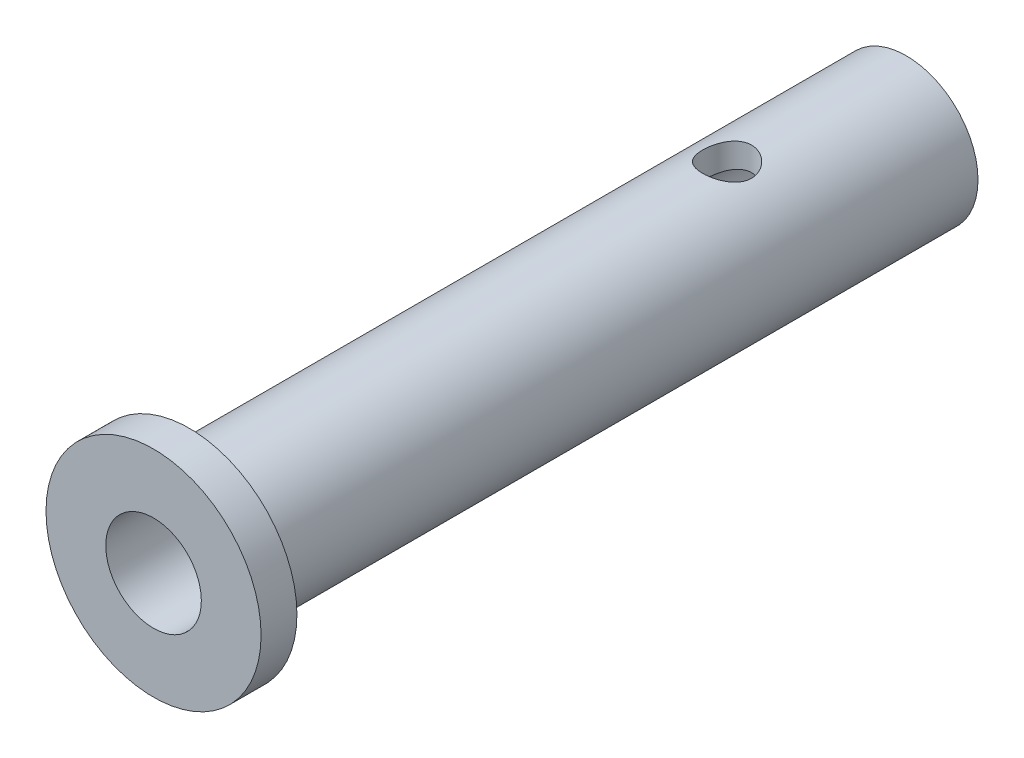
ISO-10303-21;
HEADER;
FILE_DESCRIPTION(('STEP AP214'),'2;1');
FILE_NAME('part.step','',(''),(''),'','','');
FILE_SCHEMA(('AUTOMOTIVE_DESIGN { 1 0 10303 214 1 1 1 1 }'));
ENDSEC;
DATA;
#1=APPLICATION_CONTEXT('core data for automotive mechanical design processes');
#2=APPLICATION_PROTOCOL_DEFINITION('international standard','automotive_design',2000,#1);
#3=PRODUCT_CONTEXT('',#1,'mechanical');
#4=PRODUCT('Part','Part','',(#3));
#5=PRODUCT_RELATED_PRODUCT_CATEGORY('part','',(#4));
#6=PRODUCT_DEFINITION_FORMATION('','',#4);
#7=PRODUCT_DEFINITION_CONTEXT('part definition',#1,'design');
#8=PRODUCT_DEFINITION('design','',#6,#7);
#9=PRODUCT_DEFINITION_SHAPE('','',#8);
#10=(LENGTH_UNIT() NAMED_UNIT(*) SI_UNIT(.MILLI.,.METRE.));
#11=(NAMED_UNIT(*) PLANE_ANGLE_UNIT() SI_UNIT($,.RADIAN.));
#12=(NAMED_UNIT(*) SI_UNIT($,.STERADIAN.) SOLID_ANGLE_UNIT());
#13=UNCERTAINTY_MEASURE_WITH_UNIT(LENGTH_MEASURE(1.E-05),#10,'distance_accuracy_value','');
#14=(GEOMETRIC_REPRESENTATION_CONTEXT(3) GLOBAL_UNCERTAINTY_ASSIGNED_CONTEXT((#13)) GLOBAL_UNIT_ASSIGNED_CONTEXT((#10,
#11,#12)) REPRESENTATION_CONTEXT('',''));
#15=CARTESIAN_POINT('',(0.,0.,0.));
#16=DIRECTION('',(0.,0.,1.));
#17=DIRECTION('',(1.,0.,0.));
#18=AXIS2_PLACEMENT_3D('',#15,#16,#17);
#19=CARTESIAN_POINT('',(0.,0.,0.));
#20=DIRECTION('',(0.,0.,1.));
#21=DIRECTION('',(1.,0.,0.));
#22=AXIS2_PLACEMENT_3D('',#19,#20,#21);
#23=PLANE('',#22);
#24=CARTESIAN_POINT('',(0.,0.,0.));
#25=DIRECTION('',(0.,0.,1.));
#26=DIRECTION('',(1.,0.,0.));
#27=AXIS2_PLACEMENT_3D('',#24,#25,#26);
#28=CIRCLE('',#27,6.);
#29=CARTESIAN_POINT('',(6.,0.,0.));
#30=VERTEX_POINT('',#29);
#31=EDGE_CURVE('E51',#30,#30,#28,.T.);
#32=ORIENTED_EDGE('',*,*,#31,.F.);
#33=EDGE_LOOP('',(#32));
#34=FACE_BOUND('',#33,.T.);
#35=CARTESIAN_POINT('',(0.,0.,0.));
#36=DIRECTION('',(0.,0.,1.));
#37=DIRECTION('',(1.,0.,0.));
#38=AXIS2_PLACEMENT_3D('',#35,#36,#37);
#39=CIRCLE('',#38,4.);
#40=CARTESIAN_POINT('',(4.,0.,0.));
#41=VERTEX_POINT('',#40);
#42=EDGE_CURVE('E59',#41,#41,#39,.T.);
#43=ORIENTED_EDGE('',*,*,#42,.T.);
#44=EDGE_LOOP('',(#43));
#45=FACE_BOUND('',#44,.T.);
#46=ADVANCED_FACE('F36',(#34,#45),#23,.F.);
#47=CARTESIAN_POINT('',(0.,0.,60.));
#48=DIRECTION('',(0.,0.,-1.));
#49=DIRECTION('',(-1.,0.,0.));
#50=AXIS2_PLACEMENT_3D('',#47,#48,#49);
#51=CYLINDRICAL_SURFACE('',#50,6.);
#52=CARTESIAN_POINT('',(0.,-6.,17.05));
#53=CARTESIAN_POINT('',(0.111694792858909,-6.00000073992676,17.0500011006744));
#54=CARTESIAN_POINT('',(0.223381897915284,-5.99685260756627,17.0408419154203));
#55=CARTESIAN_POINT('',(0.443456855274635,-5.9846049865183,17.0045661081946));
#56=CARTESIAN_POINT('',(0.551844528401511,-5.97550517522533,16.9774485128023));
#57=CARTESIAN_POINT('',(0.762116166706496,-5.95234070246869,16.9063006178907));
#58=CARTESIAN_POINT('',(0.864010981474843,-5.9382845943215,16.8622994436983));
#59=CARTESIAN_POINT('',(1.05897336059167,-5.90663546564497,16.7587682473504));
#60=CARTESIAN_POINT('',(1.1520390432572,-5.88904169364257,16.6992349250442));
#61=CARTESIAN_POINT('',(1.33006727595193,-5.851450511483,16.5640703137166));
#62=CARTESIAN_POINT('',(1.41466671273501,-5.83139343672144,16.4879774621349));
#63=CARTESIAN_POINT('',(1.57018420188893,-5.79145754845614,16.3228347015354));
#64=CARTESIAN_POINT('',(1.64109903355776,-5.77157877796381,16.2337817509595));
#65=CARTESIAN_POINT('',(1.7693513085043,-5.73358672426738,16.0419247580762));
#66=CARTESIAN_POINT('',(1.82620897459953,-5.71554573047046,15.9387842891935));
#67=CARTESIAN_POINT('',(1.92161460063447,-5.6841831459689,15.7236893064407));
#68=CARTESIAN_POINT('',(1.9601684725075,-5.67086003179248,15.6117376521291));
#69=CARTESIAN_POINT('',(2.01649607342442,-5.65107176337277,15.3863387462898));
#70=CARTESIAN_POINT('',(2.03495283636109,-5.64438193221697,15.2730825113464));
#71=CARTESIAN_POINT('',(2.05269785632006,-5.63795434219754,15.0448983381978));
#72=CARTESIAN_POINT('',(2.05199239642676,-5.63821430457176,14.9299709602953));
#73=CARTESIAN_POINT('',(2.03196175002273,-5.64546063678503,14.7076091420928));
#74=CARTESIAN_POINT('',(2.01353809218074,-5.65212131593619,14.6000810121759));
#75=CARTESIAN_POINT('',(1.96006848845672,-5.67088406118173,14.389745367431));
#76=CARTESIAN_POINT('',(1.92502045759868,-5.68298680979326,14.2869384464964));
#77=CARTESIAN_POINT('',(1.83872564808495,-5.71149498698225,14.0869561968235));
#78=CARTESIAN_POINT('',(1.78721826814154,-5.72796885781752,13.9899035010933));
#79=CARTESIAN_POINT('',(1.66964783804891,-5.76333553810623,13.8055383281222));
#80=CARTESIAN_POINT('',(1.60358041539568,-5.78222907348994,13.7182287887237));
#81=CARTESIAN_POINT('',(1.45447480555629,-5.82157693917334,13.5507761667373));
#82=CARTESIAN_POINT('',(1.37070277992518,-5.84205994420932,13.4712918699238));
#83=CARTESIAN_POINT('',(1.19076856023099,-5.88137234209153,13.3273233400685));
#84=CARTESIAN_POINT('',(1.09460505604537,-5.90020155973212,13.2628406951422));
#85=CARTESIAN_POINT('',(0.891166665544268,-5.93435426577647,13.1501393560035));
#86=CARTESIAN_POINT('',(0.783782236812027,-5.94963736824087,13.1021053130332));
#87=CARTESIAN_POINT('',(0.561808892830568,-5.97468167028618,13.0249907996112));
#88=CARTESIAN_POINT('',(0.447222629401273,-5.98444488928502,12.9959033970459));
#89=CARTESIAN_POINT('',(0.219669207495524,-5.99701089647794,12.9586938365146));
#90=CARTESIAN_POINT('',(0.106863622694669,-6.00010880305503,12.9496821079156));
#91=CARTESIAN_POINT('',(-0.118675471856099,-5.99988538372896,12.9503349065058));
#92=CARTESIAN_POINT('',(-0.231408990878711,-5.99656520387125,12.9599960993652));
#93=CARTESIAN_POINT('',(-0.449989439131971,-5.98407363027,12.9970213769639));
#94=CARTESIAN_POINT('',(-0.555941535580471,-5.97508513790696,13.0238324546881));
#95=CARTESIAN_POINT('',(-0.761795388188918,-5.95234414939168,13.0936980475587));
#96=CARTESIAN_POINT('',(-0.86169636432468,-5.93859104058192,13.1367546516972));
#97=CARTESIAN_POINT('',(-1.05562283317927,-5.90724765382365,13.2391736396933));
#98=CARTESIAN_POINT('',(-1.14941674652761,-5.88956376716279,13.2989450321282));
#99=CARTESIAN_POINT('',(-1.32592857805976,-5.85235539169635,13.4326202463375));
#100=CARTESIAN_POINT('',(-1.40864295035851,-5.83283031702931,13.5065285741956));
#101=CARTESIAN_POINT('',(-1.56477171280336,-5.79295224237928,13.6705592926373));
#102=CARTESIAN_POINT('',(-1.63755156897234,-5.77260433999457,13.7612883810103));
#103=CARTESIAN_POINT('',(-1.766940556433,-5.73432545769357,13.9541036946464));
#104=CARTESIAN_POINT('',(-1.82354935104245,-5.71639452810288,14.056190156309));
#105=CARTESIAN_POINT('',(-1.91877502508245,-5.68514081736998,14.2689939454274));
#106=CARTESIAN_POINT('',(-1.95741113392835,-5.67181311507377,14.3797018997449));
#107=CARTESIAN_POINT('',(-2.01530235547037,-5.65150563487898,14.6066179017525));
#108=CARTESIAN_POINT('',(-2.03456679128722,-5.64452280350263,14.7228232754436));
#109=CARTESIAN_POINT('',(-2.05241853456071,-5.63805454875059,14.9506948394589));
#110=CARTESIAN_POINT('',(-2.05206438381388,-5.63818529739301,15.0622680856813));
#111=CARTESIAN_POINT('',(-2.03331479460039,-5.64497370037337,15.2836755063015));
#112=CARTESIAN_POINT('',(-2.0149205365416,-5.65163092766803,15.3935097940056));
#113=CARTESIAN_POINT('',(-1.96137782997694,-5.67042949785274,15.6060182786398));
#114=CARTESIAN_POINT('',(-1.92658899078495,-5.68245285046972,15.7087943510224));
#115=CARTESIAN_POINT('',(-1.84154026395086,-5.71058019267023,15.9071270340103));
#116=CARTESIAN_POINT('',(-1.79127683627602,-5.72668511582202,16.0026819864456));
#117=CARTESIAN_POINT('',(-1.67404372112087,-5.76207286091338,16.1885681737578));
#118=CARTESIAN_POINT('',(-1.60641877440901,-5.78146682057555,16.2784648443193));
#119=CARTESIAN_POINT('',(-1.45747162077129,-5.82079914956623,16.44597558441));
#120=CARTESIAN_POINT('',(-1.37614544971747,-5.84073767504921,16.5235860865834));
#121=CARTESIAN_POINT('',(-1.19803272267661,-5.87991159923658,16.6675936572187));
#122=CARTESIAN_POINT('',(-1.10074263507563,-5.89908293822824,16.7333876579543));
#123=CARTESIAN_POINT('',(-0.895842339143445,-5.93365336620008,16.8476245514312));
#124=CARTESIAN_POINT('',(-0.788234154820898,-5.94905319290613,16.8960708383264));
#125=CARTESIAN_POINT('',(-0.568820190045991,-5.97396713574626,16.9728326946112));
#126=CARTESIAN_POINT('',(-0.457216156232393,-5.98363390416873,17.00167368512));
#127=CARTESIAN_POINT('',(-0.230404598197708,-5.99664896852797,17.0402537887369));
#128=CARTESIAN_POINT('',(-0.115198210280347,-5.99999923686471,17.0499988648019));
#129=CARTESIAN_POINT('',(0.,-6.,17.05));
#130=B_SPLINE_CURVE_WITH_KNOTS('',3,(#52,#53,#54,#55,#56,#57,#58,#59,#60,#61,#62,#63,#64,#65,
#66,#67,#68,#69,#70,#71,#72,#73,#74,#75,#76,#77,#78,#79,#80,#81,#82,#83,#84,#85,#86,#87,#88,#89,
#90,#91,#92,#93,#94,#95,#96,#97,#98,#99,#100,#101,#102,#103,#104,#105,#106,#107,#108,#109,#110,
#111,#112,#113,#114,#115,#116,#117,#118,#119,#120,#121,#122,#123,#124,#125,#126,#127,#128,#129),
.UNSPECIFIED.,.T.,.F.,(4,2,2,2,2,2,2,2,2,2,2,2,2,2,2,2,2,2,2,2,2,2,2,2,2,2,2,2,2,2,2,2,2,2,2,2,
2,2,4),(0.,0.334660257833486,0.669338657133644,1.00344229025213,1.33761696901913,
1.68268679490868,2.02783773495886,2.38350996217515,2.7390672327107,3.08212182358097,
3.42506393194116,3.75143184133149,4.07784069357443,4.40969746223985,4.74165402643435,
5.09187847892692,5.44213999027434,5.79621366255634,6.15015771504176,6.48807708016643,
6.8259361103018,7.15341506344945,7.4809361410696,7.81730358610379,8.15377842593176,
8.50635642349643,8.85894176121629,9.21114898665728,9.56318662197828,9.89624920524492,
10.2292899968749,10.5553434031583,10.8814714543009,11.2224163565453,11.5634600731436,
11.9187351731273,12.2739407239956,12.6192057619846,12.9643629691166),.UNSPECIFIED.);
#131=CARTESIAN_POINT('',(0.,-6.,17.05));
#132=VERTEX_POINT('',#131);
#133=EDGE_CURVE('E90',#132,#132,#130,.T.);
#134=ORIENTED_EDGE('',*,*,#133,.T.);
#135=EDGE_LOOP('',(#134));
#136=FACE_BOUND('',#135,.T.);
#137=CARTESIAN_POINT('',(0.,6.,17.05));
#138=CARTESIAN_POINT('',(-0.111694792858909,6.00000073992676,17.0500011006744));
#139=CARTESIAN_POINT('',(-0.223381897915284,5.99685260756627,17.0408419154203));
#140=CARTESIAN_POINT('',(-0.443456855274635,5.9846049865183,17.0045661081946));
#141=CARTESIAN_POINT('',(-0.551844528401511,5.97550517522533,16.9774485128023));
#142=CARTESIAN_POINT('',(-0.762116166706496,5.95234070246869,16.9063006178907));
#143=CARTESIAN_POINT('',(-0.864010981474843,5.9382845943215,16.8622994436983));
#144=CARTESIAN_POINT('',(-1.05897336059167,5.90663546564497,16.7587682473504));
#145=CARTESIAN_POINT('',(-1.1520390432572,5.88904169364257,16.6992349250442));
#146=CARTESIAN_POINT('',(-1.33006727595193,5.851450511483,16.5640703137166));
#147=CARTESIAN_POINT('',(-1.41466671273501,5.83139343672144,16.4879774621349));
#148=CARTESIAN_POINT('',(-1.57018420188893,5.79145754845614,16.3228347015354));
#149=CARTESIAN_POINT('',(-1.64109903355776,5.77157877796381,16.2337817509595));
#150=CARTESIAN_POINT('',(-1.7693513085043,5.73358672426738,16.0419247580762));
#151=CARTESIAN_POINT('',(-1.82620897459953,5.71554573047046,15.9387842891935));
#152=CARTESIAN_POINT('',(-1.92161460063447,5.6841831459689,15.7236893064407));
#153=CARTESIAN_POINT('',(-1.9601684725075,5.67086003179248,15.6117376521291));
#154=CARTESIAN_POINT('',(-2.01649607342442,5.65107176337277,15.3863387462898));
#155=CARTESIAN_POINT('',(-2.03495283636109,5.64438193221697,15.2730825113464));
#156=CARTESIAN_POINT('',(-2.05269785632006,5.63795434219754,15.0448983381978));
#157=CARTESIAN_POINT('',(-2.05199239642676,5.63821430457176,14.9299709602953));
#158=CARTESIAN_POINT('',(-2.03196175002273,5.64546063678503,14.7076091420928));
#159=CARTESIAN_POINT('',(-2.01353809218074,5.65212131593619,14.6000810121759));
#160=CARTESIAN_POINT('',(-1.96006848845672,5.67088406118173,14.389745367431));
#161=CARTESIAN_POINT('',(-1.92502045759868,5.68298680979326,14.2869384464964));
#162=CARTESIAN_POINT('',(-1.83872564808495,5.71149498698225,14.0869561968235));
#163=CARTESIAN_POINT('',(-1.78721826814154,5.72796885781752,13.9899035010933));
#164=CARTESIAN_POINT('',(-1.66964783804891,5.76333553810623,13.8055383281222));
#165=CARTESIAN_POINT('',(-1.60358041539568,5.78222907348994,13.7182287887237));
#166=CARTESIAN_POINT('',(-1.45447480555629,5.82157693917334,13.5507761667373));
#167=CARTESIAN_POINT('',(-1.37070277992518,5.84205994420932,13.4712918699238));
#168=CARTESIAN_POINT('',(-1.19076856023099,5.88137234209153,13.3273233400685));
#169=CARTESIAN_POINT('',(-1.09460505604537,5.90020155973212,13.2628406951422));
#170=CARTESIAN_POINT('',(-0.891166665544268,5.93435426577647,13.1501393560035));
#171=CARTESIAN_POINT('',(-0.783782236812027,5.94963736824087,13.1021053130332));
#172=CARTESIAN_POINT('',(-0.561808892830568,5.97468167028618,13.0249907996112));
#173=CARTESIAN_POINT('',(-0.447222629401273,5.98444488928502,12.9959033970459));
#174=CARTESIAN_POINT('',(-0.219669207495524,5.99701089647794,12.9586938365146));
#175=CARTESIAN_POINT('',(-0.106863622694669,6.00010880305503,12.9496821079156));
#176=CARTESIAN_POINT('',(0.118675471856099,5.99988538372896,12.9503349065058));
#177=CARTESIAN_POINT('',(0.231408990878711,5.99656520387125,12.9599960993652));
#178=CARTESIAN_POINT('',(0.449989439131971,5.98407363027,12.9970213769639));
#179=CARTESIAN_POINT('',(0.555941535580471,5.97508513790696,13.0238324546881));
#180=CARTESIAN_POINT('',(0.761795388188918,5.95234414939168,13.0936980475587));
#181=CARTESIAN_POINT('',(0.86169636432468,5.93859104058192,13.1367546516972));
#182=CARTESIAN_POINT('',(1.05562283317927,5.90724765382365,13.2391736396933));
#183=CARTESIAN_POINT('',(1.14941674652761,5.88956376716279,13.2989450321282));
#184=CARTESIAN_POINT('',(1.32592857805976,5.85235539169635,13.4326202463375));
#185=CARTESIAN_POINT('',(1.40864295035851,5.83283031702931,13.5065285741956));
#186=CARTESIAN_POINT('',(1.56477171280336,5.79295224237928,13.6705592926373));
#187=CARTESIAN_POINT('',(1.63755156897234,5.77260433999457,13.7612883810103));
#188=CARTESIAN_POINT('',(1.766940556433,5.73432545769357,13.9541036946464));
#189=CARTESIAN_POINT('',(1.82354935104245,5.71639452810288,14.056190156309));
#190=CARTESIAN_POINT('',(1.91877502508245,5.68514081736998,14.2689939454274));
#191=CARTESIAN_POINT('',(1.95741113392835,5.67181311507377,14.3797018997449));
#192=CARTESIAN_POINT('',(2.01530235547037,5.65150563487898,14.6066179017525));
#193=CARTESIAN_POINT('',(2.03456679128722,5.64452280350263,14.7228232754436));
#194=CARTESIAN_POINT('',(2.05241853456071,5.63805454875059,14.9506948394589));
#195=CARTESIAN_POINT('',(2.05206438381388,5.63818529739301,15.0622680856813));
#196=CARTESIAN_POINT('',(2.03331479460039,5.64497370037337,15.2836755063015));
#197=CARTESIAN_POINT('',(2.0149205365416,5.65163092766803,15.3935097940056));
#198=CARTESIAN_POINT('',(1.96137782997694,5.67042949785274,15.6060182786398));
#199=CARTESIAN_POINT('',(1.92658899078495,5.68245285046972,15.7087943510224));
#200=CARTESIAN_POINT('',(1.84154026395086,5.71058019267023,15.9071270340103));
#201=CARTESIAN_POINT('',(1.79127683627602,5.72668511582202,16.0026819864456));
#202=CARTESIAN_POINT('',(1.67404372112087,5.76207286091338,16.1885681737578));
#203=CARTESIAN_POINT('',(1.60641877440901,5.78146682057555,16.2784648443193));
#204=CARTESIAN_POINT('',(1.45747162077129,5.82079914956623,16.44597558441));
#205=CARTESIAN_POINT('',(1.37614544971747,5.84073767504921,16.5235860865834));
#206=CARTESIAN_POINT('',(1.19803272267661,5.87991159923658,16.6675936572187));
#207=CARTESIAN_POINT('',(1.10074263507563,5.89908293822824,16.7333876579543));
#208=CARTESIAN_POINT('',(0.895842339143445,5.93365336620008,16.8476245514312));
#209=CARTESIAN_POINT('',(0.788234154820898,5.94905319290613,16.8960708383264));
#210=CARTESIAN_POINT('',(0.568820190045991,5.97396713574626,16.9728326946112));
#211=CARTESIAN_POINT('',(0.457216156232393,5.98363390416873,17.00167368512));
#212=CARTESIAN_POINT('',(0.230404598197708,5.99664896852797,17.0402537887369));
#213=CARTESIAN_POINT('',(0.115198210280347,5.99999923686471,17.0499988648019));
#214=CARTESIAN_POINT('',(0.,6.,17.05));
#215=B_SPLINE_CURVE_WITH_KNOTS('',3,(#137,#138,#139,#140,#141,#142,#143,#144,#145,#146,#147,
#148,#149,#150,#151,#152,#153,#154,#155,#156,#157,#158,#159,#160,#161,#162,#163,#164,#165,#166,
#167,#168,#169,#170,#171,#172,#173,#174,#175,#176,#177,#178,#179,#180,#181,#182,#183,#184,#185,
#186,#187,#188,#189,#190,#191,#192,#193,#194,#195,#196,#197,#198,#199,#200,#201,#202,#203,#204,
#205,#206,#207,#208,#209,#210,#211,#212,#213,#214),.UNSPECIFIED.,.T.,.F.,(4,2,2,2,2,2,2,2,2,2,2,
2,2,2,2,2,2,2,2,2,2,2,2,2,2,2,2,2,2,2,2,2,2,2,2,2,2,2,4),(0.,0.334660257833486,
0.669338657133644,1.00344229025213,1.33761696901913,1.68268679490868,2.02783773495886,
2.38350996217515,2.7390672327107,3.08212182358097,3.42506393194116,3.75143184133149,
4.07784069357443,4.40969746223985,4.74165402643435,5.09187847892692,5.44213999027434,
5.79621366255634,6.15015771504176,6.48807708016643,6.8259361103018,7.15341506344945,
7.4809361410696,7.81730358610379,8.15377842593176,8.50635642349643,8.85894176121629,
9.21114898665728,9.56318662197828,9.89624920524492,10.2292899968749,10.5553434031583,
10.8814714543009,11.2224163565453,11.5634600731436,11.9187351731273,12.2739407239956,
12.6192057619846,12.9643629691166),.UNSPECIFIED.);
#216=CARTESIAN_POINT('',(0.,6.,17.05));
#217=VERTEX_POINT('',#216);
#218=EDGE_CURVE('E85',#217,#217,#215,.T.);
#219=ORIENTED_EDGE('',*,*,#218,.T.);
#220=EDGE_LOOP('',(#219));
#221=FACE_BOUND('',#220,.T.);
#222=CARTESIAN_POINT('',(0.,0.,60.));
#223=DIRECTION('',(0.,0.,1.));
#224=DIRECTION('',(1.,0.,0.));
#225=AXIS2_PLACEMENT_3D('',#222,#223,#224);
#226=CIRCLE('',#225,6.);
#227=CARTESIAN_POINT('',(6.,0.,60.));
#228=VERTEX_POINT('',#227);
#229=EDGE_CURVE('E10',#228,#228,#226,.T.);
#230=ORIENTED_EDGE('',*,*,#229,.F.);
#231=EDGE_LOOP('',(#230));
#232=FACE_BOUND('',#231,.T.);
#233=ORIENTED_EDGE('',*,*,#31,.T.);
#234=EDGE_LOOP('',(#233));
#235=FACE_BOUND('',#234,.T.);
#236=ADVANCED_FACE('F38',(#136,#221,#232,#235),#51,.T.);
#237=CARTESIAN_POINT('',(0.,0.,60.));
#238=DIRECTION('',(0.,0.,-1.));
#239=DIRECTION('',(-1.,0.,0.));
#240=AXIS2_PLACEMENT_3D('',#237,#238,#239);
#241=CYLINDRICAL_SURFACE('',#240,4.);
#242=CARTESIAN_POINT('',(0.,-4.,17.05));
#243=CARTESIAN_POINT('',(0.107446702590295,-3.99999392411465,17.0499930746046));
#244=CARTESIAN_POINT('',(0.215011695653137,-3.9956248068376,17.0415030921818));
#245=CARTESIAN_POINT('',(0.42694197617692,-3.97857707456093,17.0079284246933));
#246=CARTESIAN_POINT('',(0.531301253395356,-3.96588374280102,16.9828143483914));
#247=CARTESIAN_POINT('',(0.733435113374308,-3.93351130125312,16.9172423301945));
#248=CARTESIAN_POINT('',(0.831233928678197,-3.91385980046278,16.8768449873024));
#249=CARTESIAN_POINT('',(1.0185093540354,-3.86935610219996,16.7821780772539));
#250=CARTESIAN_POINT('',(1.10798635248956,-3.84450414762232,16.7279091579636));
#251=CARTESIAN_POINT('',(1.28238013398127,-3.79003440049741,16.6031853454344));
#252=CARTESIAN_POINT('',(1.36666044569379,-3.76021561726282,16.5319296609017));
#253=CARTESIAN_POINT('',(1.52266543451967,-3.6997975181452,16.3769869721021));
#254=CARTESIAN_POINT('',(1.59438002099889,-3.66919759737124,16.2932900759663));
#255=CARTESIAN_POINT('',(1.72916327612482,-3.60775880585849,16.1075726417205));
#256=CARTESIAN_POINT('',(1.79103018842583,-3.57710857718811,16.004609985673));
#257=CARTESIAN_POINT('',(1.89631016069108,-3.52243514976065,15.7880196998113));
#258=CARTESIAN_POINT('',(1.93973685976242,-3.49840705764386,15.6744000285543));
#259=CARTESIAN_POINT('',(2.00400041580629,-3.46197649573969,15.4467570676252));
#260=CARTESIAN_POINT('',(2.02605450219578,-3.4489538492822,15.3331818706331));
#261=CARTESIAN_POINT('',(2.05064985994217,-3.43439428152558,15.1032601234623));
#262=CARTESIAN_POINT('',(2.05321224965715,-3.43284492948717,14.9869167097065));
#263=CARTESIAN_POINT('',(2.03964223280495,-3.44091328074564,14.7706971393162));
#264=CARTESIAN_POINT('',(2.0258467575378,-3.44913535671851,14.6706090654802));
#265=CARTESIAN_POINT('',(1.98402224488651,-3.47336062408962,14.4744344526049));
#266=CARTESIAN_POINT('',(1.95598827010463,-3.48936651455189,14.3783493141532));
#267=CARTESIAN_POINT('',(1.88599690268004,-3.52769484776581,14.1901634752028));
#268=CARTESIAN_POINT('',(1.84373255468189,-3.55015478722343,14.0982062764506));
#269=CARTESIAN_POINT('',(1.74672112697299,-3.59887608121481,13.9222376195094));
#270=CARTESIAN_POINT('',(1.69196843861017,-3.62513914183154,13.838229755513));
#271=CARTESIAN_POINT('',(1.56298108208341,-3.6827593275159,13.6686833716835));
#272=CARTESIAN_POINT('',(1.48711841545625,-3.71432725365807,13.5844506043301));
#273=CARTESIAN_POINT('',(1.32225338429101,-3.77616205622663,13.4293427557605));
#274=CARTESIAN_POINT('',(1.23324416338965,-3.80642824305325,13.3584746888555));
#275=CARTESIAN_POINT('',(1.03887984487251,-3.8641308217218,13.228684105029));
#276=CARTESIAN_POINT('',(0.932922098162909,-3.89134374581138,13.1705565188613));
#277=CARTESIAN_POINT('',(0.710987094314235,-3.93793225109377,13.0734399378172));
#278=CARTESIAN_POINT('',(0.595018260627167,-3.9573143447204,13.0344350339615));
#279=CARTESIAN_POINT('',(0.366983956154637,-3.98464106381375,12.9800084332699));
#280=CARTESIAN_POINT('',(0.255433264896168,-3.99342229019431,12.9628547055115));
#281=CARTESIAN_POINT('',(0.0307090729468143,-4.00145873374373,12.9471425341054));
#282=CARTESIAN_POINT('',(-0.0824635698088822,-4.00071881395182,12.9485745975459));
#283=CARTESIAN_POINT('',(-0.297297454142624,-3.99026748856467,12.9690407486571));
#284=CARTESIAN_POINT('',(-0.399139372217549,-3.98129965318618,12.9866160873381));
#285=CARTESIAN_POINT('',(-0.598208313988757,-3.95628799007158,13.0365387316604));
#286=CARTESIAN_POINT('',(-0.695434838825576,-3.94024339935728,13.0688876301217));
#287=CARTESIAN_POINT('',(-0.885620482939882,-3.90196747626124,13.1482203307695));
#288=CARTESIAN_POINT('',(-0.978389523555437,-3.87957858543938,13.1955810547576));
#289=CARTESIAN_POINT('',(-1.1549575661932,-3.83072816630242,13.3031577147532));
#290=CARTESIAN_POINT('',(-1.23875282372248,-3.80426494903258,13.3633789859453));
#291=CARTESIAN_POINT('',(-1.4040590363934,-3.74660367542491,13.5020309582686));
#292=CARTESIAN_POINT('',(-1.48446743381182,-3.71519791217977,13.5816917910596));
#293=CARTESIAN_POINT('',(-1.63129973587215,-3.65311227346569,13.7533513685373));
#294=CARTESIAN_POINT('',(-1.69771275096012,-3.62243297960275,13.845359630096));
#295=CARTESIAN_POINT('',(-1.81816264015419,-3.56356965379434,14.045456026816));
#296=CARTESIAN_POINT('',(-1.87131407792235,-3.53561681455267,14.1541513911728));
#297=CARTESIAN_POINT('',(-1.95800598319276,-3.48836409369241,14.380820286309));
#298=CARTESIAN_POINT('',(-1.99157287601077,-3.46905256065164,14.4987810701729));
#299=CARTESIAN_POINT('',(-2.03495016691281,-3.44377010444309,14.7283962096995));
#300=CARTESIAN_POINT('',(-2.04675369347677,-3.43668429658676,14.8395479828993));
#301=CARTESIAN_POINT('',(-2.05207421616876,-3.4335129172416,15.0624225085075));
#302=CARTESIAN_POINT('',(-2.04560058953217,-3.43742170488633,15.1741449387761));
#303=CARTESIAN_POINT('',(-2.01643624026431,-3.45459300448974,15.3826191546726));
#304=CARTESIAN_POINT('',(-1.99551390273736,-3.46683362786113,15.4797138995284));
#305=CARTESIAN_POINT('',(-1.94031204589007,-3.49802632037002,15.6688826813761));
#306=CARTESIAN_POINT('',(-1.90602803547551,-3.5169806459059,15.7609550183737));
#307=CARTESIAN_POINT('',(-1.82253889530007,-3.56099904948211,15.9442815015121));
#308=CARTESIAN_POINT('',(-1.77249158626768,-3.58638613761172,16.0350721298259));
#309=CARTESIAN_POINT('',(-1.65979102055022,-3.63991555174963,16.2075683046347));
#310=CARTESIAN_POINT('',(-1.59713105944918,-3.66805933901446,16.2892689832343));
#311=CARTESIAN_POINT('',(-1.45145088406066,-3.72830722515484,16.4523227285764));
#312=CARTESIAN_POINT('',(-1.36684291713835,-3.76045063919353,16.5322505374787));
#313=CARTESIAN_POINT('',(-1.18459530715109,-3.82177614506883,16.6771361614921));
#314=CARTESIAN_POINT('',(-1.08694823011583,-3.85095653076606,16.7420853788431));
#315=CARTESIAN_POINT('',(-0.879374187984638,-3.90362778644425,16.8556331208611));
#316=CARTESIAN_POINT('',(-0.769304917517975,-3.92704031052363,16.9040096469038));
#317=CARTESIAN_POINT('',(-0.541157956541705,-3.96489782511668,16.9809211700859));
#318=CARTESIAN_POINT('',(-0.423103570547542,-3.97936775960733,17.0095113850685));
#319=CARTESIAN_POINT('',(-0.253130701046808,-3.99230233542355,17.0349464877364));
#320=CARTESIAN_POINT('',(-0.202722829473459,-3.99518057997568,17.0405826648703));
#321=CARTESIAN_POINT('',(-0.101552121583719,-3.9990308729561,17.048111106265));
#322=CARTESIAN_POINT('',(-0.0507892761103109,-4.00000287202689,17.0500032735841));
#323=CARTESIAN_POINT('',(0.,-4.,17.05));
#324=B_SPLINE_CURVE_WITH_KNOTS('',3,(#242,#243,#244,#245,#246,#247,#248,#249,#250,#251,#252,
#253,#254,#255,#256,#257,#258,#259,#260,#261,#262,#263,#264,#265,#266,#267,#268,#269,#270,#271,
#272,#273,#274,#275,#276,#277,#278,#279,#280,#281,#282,#283,#284,#285,#286,#287,#288,#289,#290,
#291,#292,#293,#294,#295,#296,#297,#298,#299,#300,#301,#302,#303,#304,#305,#306,#307,#308,#309,
#310,#311,#312,#313,#314,#315,#316,#317,#318,#319,#320,#321,#322,#323),.UNSPECIFIED.,.T.,.F.,(4,
2,2,2,2,2,2,2,2,2,2,2,2,2,2,2,2,2,2,2,2,2,2,2,2,2,2,2,2,2,2,2,2,2,2,2,2,2,2,2,4),(0.,
0.322134489086316,0.644840035437982,0.966279223485243,1.28770340159251,1.62925613349186,
1.97108189729774,2.34111430726998,2.71087254796376,3.05805757603413,3.40486639142247,
3.70755320112197,4.01034504341645,4.32013817787258,4.63007071877438,4.98156987638528,
5.33325300402027,5.70289727329518,6.07223349559286,6.409973948736,6.74754190375517,
7.05732039686388,7.36713229681175,7.68543814222137,8.00387629388894,8.35475819495828,
8.70591211099105,9.07644812388667,9.44648301145316,9.78052619909042,10.1143980344247,
10.4133231656021,10.7123488575674,11.0313041459213,11.3504294289002,11.7110310471671,
12.0718391395929,12.4373069900643,12.8017507680012,12.9540174593566,13.1062880932284),.UNSPECIFIED.);
#325=CARTESIAN_POINT('',(0.,-4.,17.05));
#326=VERTEX_POINT('',#325);
#327=EDGE_CURVE('E41',#326,#326,#324,.T.);
#328=ORIENTED_EDGE('',*,*,#327,.F.);
#329=EDGE_LOOP('',(#328));
#330=FACE_BOUND('',#329,.T.);
#331=CARTESIAN_POINT('',(0.,4.,17.05));
#332=CARTESIAN_POINT('',(-0.107446702590295,3.99999392411465,17.0499930746046));
#333=CARTESIAN_POINT('',(-0.215011695653137,3.9956248068376,17.0415030921818));
#334=CARTESIAN_POINT('',(-0.42694197617692,3.97857707456093,17.0079284246933));
#335=CARTESIAN_POINT('',(-0.531301253395356,3.96588374280102,16.9828143483914));
#336=CARTESIAN_POINT('',(-0.733435113374308,3.93351130125312,16.9172423301945));
#337=CARTESIAN_POINT('',(-0.831233928678197,3.91385980046278,16.8768449873024));
#338=CARTESIAN_POINT('',(-1.0185093540354,3.86935610219996,16.7821780772539));
#339=CARTESIAN_POINT('',(-1.10798635248956,3.84450414762232,16.7279091579636));
#340=CARTESIAN_POINT('',(-1.28238013398127,3.79003440049741,16.6031853454344));
#341=CARTESIAN_POINT('',(-1.36666044569379,3.76021561726282,16.5319296609017));
#342=CARTESIAN_POINT('',(-1.52266543451967,3.6997975181452,16.3769869721021));
#343=CARTESIAN_POINT('',(-1.59438002099889,3.66919759737124,16.2932900759663));
#344=CARTESIAN_POINT('',(-1.72916327612482,3.60775880585849,16.1075726417205));
#345=CARTESIAN_POINT('',(-1.79103018842583,3.57710857718811,16.004609985673));
#346=CARTESIAN_POINT('',(-1.89631016069108,3.52243514976065,15.7880196998113));
#347=CARTESIAN_POINT('',(-1.93973685976242,3.49840705764386,15.6744000285543));
#348=CARTESIAN_POINT('',(-2.00400041580629,3.46197649573969,15.4467570676252));
#349=CARTESIAN_POINT('',(-2.02605450219578,3.4489538492822,15.3331818706331));
#350=CARTESIAN_POINT('',(-2.05064985994217,3.43439428152558,15.1032601234623));
#351=CARTESIAN_POINT('',(-2.05321224965715,3.43284492948717,14.9869167097065));
#352=CARTESIAN_POINT('',(-2.03964223280495,3.44091328074564,14.7706971393162));
#353=CARTESIAN_POINT('',(-2.0258467575378,3.44913535671851,14.6706090654802));
#354=CARTESIAN_POINT('',(-1.98402224488651,3.47336062408962,14.4744344526049));
#355=CARTESIAN_POINT('',(-1.95598827010463,3.48936651455189,14.3783493141532));
#356=CARTESIAN_POINT('',(-1.88599690268004,3.52769484776581,14.1901634752028));
#357=CARTESIAN_POINT('',(-1.84373255468189,3.55015478722343,14.0982062764506));
#358=CARTESIAN_POINT('',(-1.74672112697299,3.59887608121481,13.9222376195094));
#359=CARTESIAN_POINT('',(-1.69196843861017,3.62513914183154,13.838229755513));
#360=CARTESIAN_POINT('',(-1.56298108208341,3.6827593275159,13.6686833716835));
#361=CARTESIAN_POINT('',(-1.48711841545625,3.71432725365807,13.5844506043301));
#362=CARTESIAN_POINT('',(-1.32225338429101,3.77616205622663,13.4293427557605));
#363=CARTESIAN_POINT('',(-1.23324416338965,3.80642824305325,13.3584746888555));
#364=CARTESIAN_POINT('',(-1.03887984487251,3.8641308217218,13.228684105029));
#365=CARTESIAN_POINT('',(-0.932922098162909,3.89134374581138,13.1705565188613));
#366=CARTESIAN_POINT('',(-0.710987094314235,3.93793225109377,13.0734399378172));
#367=CARTESIAN_POINT('',(-0.595018260627167,3.9573143447204,13.0344350339615));
#368=CARTESIAN_POINT('',(-0.366983956154637,3.98464106381375,12.9800084332699));
#369=CARTESIAN_POINT('',(-0.255433264896168,3.99342229019431,12.9628547055115));
#370=CARTESIAN_POINT('',(-0.0307090729468143,4.00145873374373,12.9471425341054));
#371=CARTESIAN_POINT('',(0.0824635698088822,4.00071881395182,12.9485745975459));
#372=CARTESIAN_POINT('',(0.297297454142624,3.99026748856467,12.9690407486571));
#373=CARTESIAN_POINT('',(0.399139372217549,3.98129965318618,12.9866160873381));
#374=CARTESIAN_POINT('',(0.598208313988757,3.95628799007158,13.0365387316604));
#375=CARTESIAN_POINT('',(0.695434838825576,3.94024339935728,13.0688876301217));
#376=CARTESIAN_POINT('',(0.885620482939882,3.90196747626124,13.1482203307695));
#377=CARTESIAN_POINT('',(0.978389523555437,3.87957858543938,13.1955810547576));
#378=CARTESIAN_POINT('',(1.1549575661932,3.83072816630242,13.3031577147532));
#379=CARTESIAN_POINT('',(1.23875282372248,3.80426494903258,13.3633789859453));
#380=CARTESIAN_POINT('',(1.4040590363934,3.74660367542491,13.5020309582686));
#381=CARTESIAN_POINT('',(1.48446743381182,3.71519791217977,13.5816917910596));
#382=CARTESIAN_POINT('',(1.63129973587215,3.65311227346569,13.7533513685373));
#383=CARTESIAN_POINT('',(1.69771275096012,3.62243297960275,13.845359630096));
#384=CARTESIAN_POINT('',(1.81816264015419,3.56356965379434,14.045456026816));
#385=CARTESIAN_POINT('',(1.87131407792235,3.53561681455267,14.1541513911728));
#386=CARTESIAN_POINT('',(1.95800598319276,3.48836409369241,14.380820286309));
#387=CARTESIAN_POINT('',(1.99157287601077,3.46905256065164,14.4987810701729));
#388=CARTESIAN_POINT('',(2.03495016691281,3.44377010444309,14.7283962096995));
#389=CARTESIAN_POINT('',(2.04675369347677,3.43668429658676,14.8395479828993));
#390=CARTESIAN_POINT('',(2.05207421616876,3.4335129172416,15.0624225085075));
#391=CARTESIAN_POINT('',(2.04560058953217,3.43742170488633,15.1741449387761));
#392=CARTESIAN_POINT('',(2.01643624026431,3.45459300448974,15.3826191546726));
#393=CARTESIAN_POINT('',(1.99551390273736,3.46683362786113,15.4797138995284));
#394=CARTESIAN_POINT('',(1.94031204589007,3.49802632037002,15.6688826813761));
#395=CARTESIAN_POINT('',(1.90602803547551,3.5169806459059,15.7609550183737));
#396=CARTESIAN_POINT('',(1.82253889530007,3.56099904948211,15.9442815015121));
#397=CARTESIAN_POINT('',(1.77249158626768,3.58638613761172,16.0350721298259));
#398=CARTESIAN_POINT('',(1.65979102055022,3.63991555174963,16.2075683046347));
#399=CARTESIAN_POINT('',(1.59713105944918,3.66805933901446,16.2892689832343));
#400=CARTESIAN_POINT('',(1.45145088406066,3.72830722515484,16.4523227285764));
#401=CARTESIAN_POINT('',(1.36684291713835,3.76045063919353,16.5322505374787));
#402=CARTESIAN_POINT('',(1.18459530715109,3.82177614506883,16.6771361614921));
#403=CARTESIAN_POINT('',(1.08694823011583,3.85095653076606,16.7420853788431));
#404=CARTESIAN_POINT('',(0.879374187984638,3.90362778644425,16.8556331208611));
#405=CARTESIAN_POINT('',(0.769304917517975,3.92704031052363,16.9040096469038));
#406=CARTESIAN_POINT('',(0.541157956541705,3.96489782511668,16.9809211700859));
#407=CARTESIAN_POINT('',(0.423103570547542,3.97936775960733,17.0095113850685));
#408=CARTESIAN_POINT('',(0.253130701046808,3.99230233542355,17.0349464877364));
#409=CARTESIAN_POINT('',(0.202722829473459,3.99518057997568,17.0405826648703));
#410=CARTESIAN_POINT('',(0.101552121583719,3.9990308729561,17.048111106265));
#411=CARTESIAN_POINT('',(0.0507892761103109,4.00000287202689,17.0500032735841));
#412=CARTESIAN_POINT('',(0.,4.,17.05));
#413=B_SPLINE_CURVE_WITH_KNOTS('',3,(#331,#332,#333,#334,#335,#336,#337,#338,#339,#340,#341,
#342,#343,#344,#345,#346,#347,#348,#349,#350,#351,#352,#353,#354,#355,#356,#357,#358,#359,#360,
#361,#362,#363,#364,#365,#366,#367,#368,#369,#370,#371,#372,#373,#374,#375,#376,#377,#378,#379,
#380,#381,#382,#383,#384,#385,#386,#387,#388,#389,#390,#391,#392,#393,#394,#395,#396,#397,#398,
#399,#400,#401,#402,#403,#404,#405,#406,#407,#408,#409,#410,#411,#412),.UNSPECIFIED.,.T.,.F.,(4,
2,2,2,2,2,2,2,2,2,2,2,2,2,2,2,2,2,2,2,2,2,2,2,2,2,2,2,2,2,2,2,2,2,2,2,2,2,2,2,4),(0.,
0.322134489086316,0.644840035437982,0.966279223485243,1.28770340159251,1.62925613349186,
1.97108189729774,2.34111430726998,2.71087254796376,3.05805757603413,3.40486639142247,
3.70755320112197,4.01034504341645,4.32013817787258,4.63007071877438,4.98156987638528,
5.33325300402027,5.70289727329518,6.07223349559286,6.409973948736,6.74754190375517,
7.05732039686388,7.36713229681175,7.68543814222137,8.00387629388894,8.35475819495828,
8.70591211099105,9.07644812388667,9.44648301145316,9.78052619909042,10.1143980344247,
10.4133231656021,10.7123488575674,11.0313041459213,11.3504294289002,11.7110310471671,
12.0718391395929,12.4373069900643,12.8017507680012,12.9540174593566,13.1062880932284),.UNSPECIFIED.);
#414=CARTESIAN_POINT('',(0.,4.,17.05));
#415=VERTEX_POINT('',#414);
#416=EDGE_CURVE('E63',#415,#415,#413,.T.);
#417=ORIENTED_EDGE('',*,*,#416,.F.);
#418=EDGE_LOOP('',(#417));
#419=FACE_BOUND('',#418,.T.);
#420=ORIENTED_EDGE('',*,*,#42,.F.);
#421=EDGE_LOOP('',(#420));
#422=FACE_BOUND('',#421,.T.);
#423=CARTESIAN_POINT('',(0.,0.,63.));
#424=DIRECTION('',(0.,0.,1.));
#425=DIRECTION('',(1.,0.,0.));
#426=AXIS2_PLACEMENT_3D('',#423,#424,#425);
#427=CIRCLE('',#426,4.);
#428=CARTESIAN_POINT('',(4.,0.,63.));
#429=VERTEX_POINT('',#428);
#430=EDGE_CURVE('E97',#429,#429,#427,.T.);
#431=ORIENTED_EDGE('',*,*,#430,.T.);
#432=EDGE_LOOP('',(#431));
#433=FACE_BOUND('',#432,.T.);
#434=ADVANCED_FACE('F69',(#330,#419,#422,#433),#241,.F.);
#435=CARTESIAN_POINT('',(0.,0.,63.));
#436=DIRECTION('',(0.,0.,1.));
#437=DIRECTION('',(1.,0.,0.));
#438=AXIS2_PLACEMENT_3D('',#435,#436,#437);
#439=PLANE('',#438);
#440=CARTESIAN_POINT('',(0.,0.,63.));
#441=DIRECTION('',(0.,0.,1.));
#442=DIRECTION('',(1.,0.,0.));
#443=AXIS2_PLACEMENT_3D('',#440,#441,#442);
#444=CIRCLE('',#443,9.);
#445=CARTESIAN_POINT('',(9.,0.,63.));
#446=VERTEX_POINT('',#445);
#447=EDGE_CURVE('E102',#446,#446,#444,.T.);
#448=ORIENTED_EDGE('',*,*,#447,.T.);
#449=EDGE_LOOP('',(#448));
#450=FACE_BOUND('',#449,.T.);
#451=ORIENTED_EDGE('',*,*,#430,.F.);
#452=EDGE_LOOP('',(#451));
#453=FACE_BOUND('',#452,.T.);
#454=ADVANCED_FACE('F78',(#450,#453),#439,.T.);
#455=CARTESIAN_POINT('',(0.,0.,60.));
#456=DIRECTION('',(0.,0.,1.));
#457=DIRECTION('',(1.,0.,0.));
#458=AXIS2_PLACEMENT_3D('',#455,#456,#457);
#459=PLANE('',#458);
#460=ORIENTED_EDGE('',*,*,#229,.T.);
#461=EDGE_LOOP('',(#460));
#462=FACE_BOUND('',#461,.T.);
#463=CARTESIAN_POINT('',(0.,0.,60.));
#464=DIRECTION('',(0.,0.,1.));
#465=DIRECTION('',(1.,0.,0.));
#466=AXIS2_PLACEMENT_3D('',#463,#464,#465);
#467=CIRCLE('',#466,9.);
#468=CARTESIAN_POINT('',(9.,0.,60.));
#469=VERTEX_POINT('',#468);
#470=EDGE_CURVE('E101',#469,#469,#467,.T.);
#471=ORIENTED_EDGE('',*,*,#470,.F.);
#472=EDGE_LOOP('',(#471));
#473=FACE_BOUND('',#472,.T.);
#474=ADVANCED_FACE('F111',(#462,#473),#459,.F.);
#475=CARTESIAN_POINT('',(0.,0.,63.));
#476=DIRECTION('',(0.,0.,-1.));
#477=DIRECTION('',(-1.,0.,0.));
#478=AXIS2_PLACEMENT_3D('',#475,#476,#477);
#479=CYLINDRICAL_SURFACE('',#478,9.);
#480=ORIENTED_EDGE('',*,*,#447,.F.);
#481=EDGE_LOOP('',(#480));
#482=FACE_BOUND('',#481,.T.);
#483=ORIENTED_EDGE('',*,*,#470,.T.);
#484=EDGE_LOOP('',(#483));
#485=FACE_BOUND('',#484,.T.);
#486=ADVANCED_FACE('F109',(#482,#485),#479,.T.);
#487=CARTESIAN_POINT('',(0.,-25.,15.));
#488=DIRECTION('',(0.,1.,0.));
#489=DIRECTION('',(0.,0.,1.));
#490=AXIS2_PLACEMENT_3D('',#487,#488,#489);
#491=CYLINDRICAL_SURFACE('',#490,2.05);
#492=ORIENTED_EDGE('',*,*,#416,.T.);
#493=EDGE_LOOP('',(#492));
#494=FACE_BOUND('',#493,.T.);
#495=ORIENTED_EDGE('',*,*,#218,.F.);
#496=EDGE_LOOP('',(#495));
#497=FACE_BOUND('',#496,.T.);
#498=ADVANCED_FACE('F76',(#494,#497),#491,.F.);
#499=ORIENTED_EDGE('',*,*,#327,.T.);
#500=EDGE_LOOP('',(#499));
#501=FACE_BOUND('',#500,.T.);
#502=ORIENTED_EDGE('',*,*,#133,.F.);
#503=EDGE_LOOP('',(#502));
#504=FACE_BOUND('',#503,.T.);
#505=ADVANCED_FACE('F72',(#501,#504),#491,.F.);
#506=CLOSED_SHELL('',(#46,#236,#434,#454,#474,#486,#498,#505));
#507=MANIFOLD_SOLID_BREP('B2',#506);
#508=ADVANCED_BREP_SHAPE_REPRESENTATION('',(#18,#507),#14);
#509=SHAPE_DEFINITION_REPRESENTATION(#9,#508);
ENDSEC;
END-ISO-10303-21;
